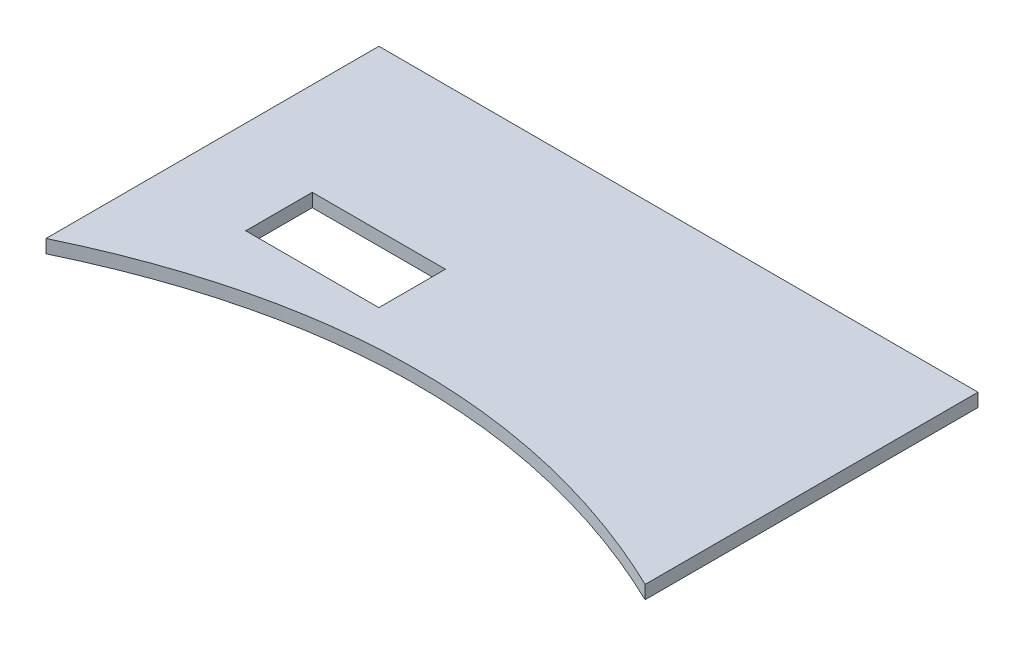
ISO-10303-21;
HEADER;
FILE_DESCRIPTION(('STEP AP214'),'2;1');
FILE_NAME('part.step','',(''),(''),'','','');
FILE_SCHEMA(('AUTOMOTIVE_DESIGN { 1 0 10303 214 1 1 1 1 }'));
ENDSEC;
DATA;
#1=APPLICATION_CONTEXT('core data for automotive mechanical design processes');
#2=APPLICATION_PROTOCOL_DEFINITION('international standard','automotive_design',2000,#1);
#3=PRODUCT_CONTEXT('',#1,'mechanical');
#4=PRODUCT('Part','Part','',(#3));
#5=PRODUCT_RELATED_PRODUCT_CATEGORY('part','',(#4));
#6=PRODUCT_DEFINITION_FORMATION('','',#4);
#7=PRODUCT_DEFINITION_CONTEXT('part definition',#1,'design');
#8=PRODUCT_DEFINITION('design','',#6,#7);
#9=PRODUCT_DEFINITION_SHAPE('','',#8);
#10=(LENGTH_UNIT() NAMED_UNIT(*) SI_UNIT(.MILLI.,.METRE.));
#11=(NAMED_UNIT(*) PLANE_ANGLE_UNIT() SI_UNIT($,.RADIAN.));
#12=(NAMED_UNIT(*) SI_UNIT($,.STERADIAN.) SOLID_ANGLE_UNIT());
#13=UNCERTAINTY_MEASURE_WITH_UNIT(LENGTH_MEASURE(1.E-05),#10,'distance_accuracy_value','');
#14=(GEOMETRIC_REPRESENTATION_CONTEXT(3) GLOBAL_UNCERTAINTY_ASSIGNED_CONTEXT((#13)) GLOBAL_UNIT_ASSIGNED_CONTEXT((#10,
#11,#12)) REPRESENTATION_CONTEXT('',''));
#15=CARTESIAN_POINT('',(0.,0.,0.));
#16=DIRECTION('',(0.,0.,1.));
#17=DIRECTION('',(1.,0.,0.));
#18=AXIS2_PLACEMENT_3D('',#15,#16,#17);
#19=CARTESIAN_POINT('',(-22.5,1.,12.5000003165409));
#20=CARTESIAN_POINT('',(-22.4397921681723,1.,12.4710624969978));
#21=CARTESIAN_POINT('',(-21.7203183892143,1.,12.1266713984864));
#22=CARTESIAN_POINT('',(-20.0332785478736,1.,11.3582096851381));
#23=CARTESIAN_POINT('',(-16.4871667514286,1.,9.92959339127587));
#24=CARTESIAN_POINT('',(-11.6492588308455,1.,8.4284125221381));
#25=CARTESIAN_POINT('',(-5.83109083774038,1.,7.34466532482607));
#26=CARTESIAN_POINT('',(-7.74170335046435E-08,1.,6.98122403326633));
#27=CARTESIAN_POINT('',(5.8310906931097,1.,7.34466516079498));
#28=CARTESIAN_POINT('',(11.6492587166721,1.,8.42841219441308));
#29=CARTESIAN_POINT('',(16.4871666794626,1.,9.92959292745506));
#30=CARTESIAN_POINT('',(20.033278516084,1.,11.3582091215817));
#31=CARTESIAN_POINT('',(21.7203183789281,1.,12.1266707874387));
#32=CARTESIAN_POINT('',(22.4397921674612,1.,12.4710618656634));
#33=CARTESIAN_POINT('',(22.4999999999906,1.,12.4999996834591));
#34=B_SPLINE_CURVE_WITH_KNOTS('',3,(#19,#20,#21,#22,#23,#24,#25,#26,#27,#28,#29,#30,#31,#32,
#33),.UNSPECIFIED.,.F.,.F.,(4,1,1,1,1,1,1,1,1,1,1,1,4),(0.0297124984412473,0.0335156519759702,
0.0751873987796753,0.135874913239724,0.25724994215982,0.378624971079917,0.500000000000013,
0.62137502892011,0.742750057840206,0.864125086760303,0.924812601220351,0.966484348023973,
0.970287501551606),.UNSPECIFIED.);
#35=DIRECTION('',(0.,-1.,0.));
#36=VECTOR('',#35,1.);
#37=SURFACE_OF_LINEAR_EXTRUSION('',#34,#36);
#38=CARTESIAN_POINT('',(-22.5,0.,12.5000003165409));
#39=CARTESIAN_POINT('',(-22.4397921681723,0.,12.4710624969978));
#40=CARTESIAN_POINT('',(-21.7203183892143,0.,12.1266713984864));
#41=CARTESIAN_POINT('',(-20.0332785478736,0.,11.3582096851381));
#42=CARTESIAN_POINT('',(-16.4871667514286,0.,9.92959339127587));
#43=CARTESIAN_POINT('',(-11.6492588308455,0.,8.4284125221381));
#44=CARTESIAN_POINT('',(-5.83109083774038,0.,7.34466532482607));
#45=CARTESIAN_POINT('',(-7.74170335046435E-08,0.,6.98122403326633));
#46=CARTESIAN_POINT('',(5.8310906931097,0.,7.34466516079498));
#47=CARTESIAN_POINT('',(11.6492587166721,0.,8.42841219441308));
#48=CARTESIAN_POINT('',(16.4871666794626,0.,9.92959292745506));
#49=CARTESIAN_POINT('',(20.033278516084,0.,11.3582091215817));
#50=CARTESIAN_POINT('',(21.7203183789281,0.,12.1266707874387));
#51=CARTESIAN_POINT('',(22.4397921674612,0.,12.4710618656634));
#52=CARTESIAN_POINT('',(22.4999999999906,0.,12.4999996834591));
#53=B_SPLINE_CURVE_WITH_KNOTS('',3,(#38,#39,#40,#41,#42,#43,#44,#45,#46,#47,#48,#49,#50,#51,
#52),.UNSPECIFIED.,.F.,.F.,(4,1,1,1,1,1,1,1,1,1,1,1,4),(0.0297124984412473,0.0335156519759702,
0.0751873987796753,0.135874913239724,0.25724994215982,0.378624971079917,0.500000000000013,
0.62137502892011,0.742750057840206,0.864125086760303,0.924812601220351,0.966484348023973,
0.970287501551606),.UNSPECIFIED.);
#54=CARTESIAN_POINT('',(-22.5,0.,12.5000003165409));
#55=VERTEX_POINT('',#54);
#56=CARTESIAN_POINT('',(22.4999999999965,0.,12.4999996834591));
#57=VERTEX_POINT('',#56);
#58=EDGE_CURVE('E131',#55,#57,#53,.T.);
#59=ORIENTED_EDGE('',*,*,#58,.T.);
#60=DIRECTION('',(0.,-1.,0.));
#61=VECTOR('',#60,1.);
#62=CARTESIAN_POINT('',(22.4999999999965,1.,12.4999996834591));
#63=LINE('',#62,#61);
#64=CARTESIAN_POINT('',(22.4999999999965,1.,12.4999996834591));
#65=VERTEX_POINT('',#64);
#66=EDGE_CURVE('E11',#65,#57,#63,.T.);
#67=ORIENTED_EDGE('',*,*,#66,.F.);
#68=CARTESIAN_POINT('',(-22.5,1.,12.5000003165409));
#69=VERTEX_POINT('',#68);
#70=EDGE_CURVE('E134',#69,#65,#34,.T.);
#71=ORIENTED_EDGE('',*,*,#70,.F.);
#72=DIRECTION('',(0.,-1.,0.));
#73=VECTOR('',#72,1.);
#74=CARTESIAN_POINT('',(-22.5,1.,12.5000003165409));
#75=LINE('',#74,#73);
#76=EDGE_CURVE('E150',#69,#55,#75,.T.);
#77=ORIENTED_EDGE('',*,*,#76,.T.);
#78=EDGE_LOOP('',(#59,#67,#71,#77));
#79=FACE_BOUND('',#78,.T.);
#80=ADVANCED_FACE('F33',(#79),#37,.F.);
#81=CARTESIAN_POINT('',(22.5,1.,-12.5000003165409));
#82=DIRECTION('',(-1.,0.,-1.38639100200066E-13));
#83=DIRECTION('',(-1.38639100200066E-13,0.,1.));
#84=AXIS2_PLACEMENT_3D('',#81,#82,#83);
#85=PLANE('',#84);
#86=DIRECTION('',(1.38639100200066E-13,0.,-1.));
#87=VECTOR('',#86,1.);
#88=CARTESIAN_POINT('',(22.5,0.,-12.5000003165409));
#89=LINE('',#88,#87);
#90=CARTESIAN_POINT('',(22.5,0.,-12.5000003165409));
#91=VERTEX_POINT('',#90);
#92=EDGE_CURVE('E155',#57,#91,#89,.T.);
#93=ORIENTED_EDGE('',*,*,#92,.T.);
#94=DIRECTION('',(0.,-1.,0.));
#95=VECTOR('',#94,1.);
#96=CARTESIAN_POINT('',(22.5,1.,-12.5000003165409));
#97=LINE('',#96,#95);
#98=CARTESIAN_POINT('',(22.5,1.,-12.5000003165409));
#99=VERTEX_POINT('',#98);
#100=EDGE_CURVE('E41',#99,#91,#97,.T.);
#101=ORIENTED_EDGE('',*,*,#100,.F.);
#102=DIRECTION('',(1.38639100200066E-13,0.,-1.));
#103=VECTOR('',#102,1.);
#104=CARTESIAN_POINT('',(22.5,1.,-12.5000003165409));
#105=LINE('',#104,#103);
#106=EDGE_CURVE('E140',#65,#99,#105,.T.);
#107=ORIENTED_EDGE('',*,*,#106,.F.);
#108=ORIENTED_EDGE('',*,*,#66,.T.);
#109=EDGE_LOOP('',(#93,#101,#107,#108));
#110=FACE_BOUND('',#109,.T.);
#111=ADVANCED_FACE('F186',(#110),#85,.F.);
#112=CARTESIAN_POINT('',(-22.5,1.,-12.5000003165409));
#113=DIRECTION('',(0.,0.,1.));
#114=DIRECTION('',(1.,0.,0.));
#115=AXIS2_PLACEMENT_3D('',#112,#113,#114);
#116=PLANE('',#115);
#117=DIRECTION('',(-1.,0.,0.));
#118=VECTOR('',#117,1.);
#119=CARTESIAN_POINT('',(-22.5,0.,-12.5000003165409));
#120=LINE('',#119,#118);
#121=CARTESIAN_POINT('',(-22.5,0.,-12.5000003165409));
#122=VERTEX_POINT('',#121);
#123=EDGE_CURVE('E160',#91,#122,#120,.T.);
#124=ORIENTED_EDGE('',*,*,#123,.T.);
#125=DIRECTION('',(0.,-1.,0.));
#126=VECTOR('',#125,1.);
#127=CARTESIAN_POINT('',(-22.5,1.,-12.5000003165409));
#128=LINE('',#127,#126);
#129=CARTESIAN_POINT('',(-22.5,1.,-12.5000003165409));
#130=VERTEX_POINT('',#129);
#131=EDGE_CURVE('E165',#130,#122,#128,.T.);
#132=ORIENTED_EDGE('',*,*,#131,.F.);
#133=DIRECTION('',(-1.,0.,0.));
#134=VECTOR('',#133,1.);
#135=CARTESIAN_POINT('',(-22.5,1.,-12.5000003165409));
#136=LINE('',#135,#134);
#137=EDGE_CURVE('E146',#99,#130,#136,.T.);
#138=ORIENTED_EDGE('',*,*,#137,.F.);
#139=ORIENTED_EDGE('',*,*,#100,.T.);
#140=EDGE_LOOP('',(#124,#132,#138,#139));
#141=FACE_BOUND('',#140,.T.);
#142=ADVANCED_FACE('F172',(#141),#116,.F.);
#143=CARTESIAN_POINT('',(-22.5,1.,12.5000003165409));
#144=DIRECTION('',(1.,0.,0.));
#145=DIRECTION('',(0.,0.,-1.));
#146=AXIS2_PLACEMENT_3D('',#143,#144,#145);
#147=PLANE('',#146);
#148=DIRECTION('',(0.,0.,1.));
#149=VECTOR('',#148,1.);
#150=CARTESIAN_POINT('',(-22.5,0.,12.5000003165409));
#151=LINE('',#150,#149);
#152=EDGE_CURVE('E141',#122,#55,#151,.T.);
#153=ORIENTED_EDGE('',*,*,#152,.T.);
#154=ORIENTED_EDGE('',*,*,#76,.F.);
#155=DIRECTION('',(0.,0.,1.));
#156=VECTOR('',#155,1.);
#157=CARTESIAN_POINT('',(-22.5,1.,12.5000003165409));
#158=LINE('',#157,#156);
#159=EDGE_CURVE('E148',#130,#69,#158,.T.);
#160=ORIENTED_EDGE('',*,*,#159,.F.);
#161=ORIENTED_EDGE('',*,*,#131,.T.);
#162=EDGE_LOOP('',(#153,#154,#160,#161));
#163=FACE_BOUND('',#162,.T.);
#164=ADVANCED_FACE('F179',(#163),#147,.F.);
#165=CARTESIAN_POINT('',(-7.58887755678566E-08,1.,7.1023711031144));
#166=DIRECTION('',(0.,1.,0.));
#167=DIRECTION('',(0.,0.,1.));
#168=AXIS2_PLACEMENT_3D('',#165,#166,#167);
#169=PLANE('',#168);
#170=DIRECTION('',(0.,0.,1.));
#171=VECTOR('',#170,1.);
#172=CARTESIAN_POINT('',(-15.5,1.,4.49999968345912));
#173=LINE('',#172,#171);
#174=CARTESIAN_POINT('',(-15.5,1.,-0.500000316540883));
#175=VERTEX_POINT('',#174);
#176=CARTESIAN_POINT('',(-15.5,1.,4.49999968345912));
#177=VERTEX_POINT('',#176);
#178=EDGE_CURVE('E48',#175,#177,#173,.T.);
#179=ORIENTED_EDGE('',*,*,#178,.F.);
#180=DIRECTION('',(-1.,0.,0.));
#181=VECTOR('',#180,1.);
#182=CARTESIAN_POINT('',(-15.5,1.,-0.500000316540883));
#183=LINE('',#182,#181);
#184=CARTESIAN_POINT('',(-5.5,1.,-0.500000316540883));
#185=VERTEX_POINT('',#184);
#186=EDGE_CURVE('E116',#185,#175,#183,.T.);
#187=ORIENTED_EDGE('',*,*,#186,.F.);
#188=DIRECTION('',(0.,0.,-1.));
#189=VECTOR('',#188,1.);
#190=CARTESIAN_POINT('',(-5.5,1.,4.49999968345912));
#191=LINE('',#190,#189);
#192=CARTESIAN_POINT('',(-5.5,1.,4.49999968345912));
#193=VERTEX_POINT('',#192);
#194=EDGE_CURVE('E119',#193,#185,#191,.T.);
#195=ORIENTED_EDGE('',*,*,#194,.F.);
#196=DIRECTION('',(1.,0.,0.));
#197=VECTOR('',#196,1.);
#198=CARTESIAN_POINT('',(-15.5,1.,4.49999968345912));
#199=LINE('',#198,#197);
#200=EDGE_CURVE('E125',#177,#193,#199,.T.);
#201=ORIENTED_EDGE('',*,*,#200,.F.);
#202=EDGE_LOOP('',(#179,#187,#195,#201));
#203=FACE_BOUND('',#202,.T.);
#204=ORIENTED_EDGE('',*,*,#70,.T.);
#205=ORIENTED_EDGE('',*,*,#106,.T.);
#206=ORIENTED_EDGE('',*,*,#137,.T.);
#207=ORIENTED_EDGE('',*,*,#159,.T.);
#208=EDGE_LOOP('',(#204,#205,#206,#207));
#209=FACE_BOUND('',#208,.T.);
#210=ADVANCED_FACE('F185',(#203,#209),#169,.T.);
#211=CARTESIAN_POINT('',(-7.58887755678566E-08,0.,7.1023711031144));
#212=DIRECTION('',(0.,1.,0.));
#213=DIRECTION('',(0.,0.,1.));
#214=AXIS2_PLACEMENT_3D('',#211,#212,#213);
#215=PLANE('',#214);
#216=DIRECTION('',(-1.,0.,0.));
#217=VECTOR('',#216,1.);
#218=CARTESIAN_POINT('',(-15.5,0.,-0.500000316540883));
#219=LINE('',#218,#217);
#220=CARTESIAN_POINT('',(-5.5,0.,-0.500000316540883));
#221=VERTEX_POINT('',#220);
#222=CARTESIAN_POINT('',(-15.5,0.,-0.500000316540883));
#223=VERTEX_POINT('',#222);
#224=EDGE_CURVE('E106',#221,#223,#219,.T.);
#225=ORIENTED_EDGE('',*,*,#224,.T.);
#226=DIRECTION('',(0.,0.,1.));
#227=VECTOR('',#226,1.);
#228=CARTESIAN_POINT('',(-15.5,0.,4.49999968345912));
#229=LINE('',#228,#227);
#230=CARTESIAN_POINT('',(-15.5,0.,4.49999968345912));
#231=VERTEX_POINT('',#230);
#232=EDGE_CURVE('E100',#223,#231,#229,.T.);
#233=ORIENTED_EDGE('',*,*,#232,.T.);
#234=DIRECTION('',(1.,0.,0.));
#235=VECTOR('',#234,1.);
#236=CARTESIAN_POINT('',(-15.5,0.,4.49999968345912));
#237=LINE('',#236,#235);
#238=CARTESIAN_POINT('',(-5.5,0.,4.49999968345912));
#239=VERTEX_POINT('',#238);
#240=EDGE_CURVE('E109',#231,#239,#237,.T.);
#241=ORIENTED_EDGE('',*,*,#240,.T.);
#242=DIRECTION('',(0.,0.,-1.));
#243=VECTOR('',#242,1.);
#244=CARTESIAN_POINT('',(-5.5,0.,4.49999968345912));
#245=LINE('',#244,#243);
#246=EDGE_CURVE('E56',#239,#221,#245,.T.);
#247=ORIENTED_EDGE('',*,*,#246,.T.);
#248=EDGE_LOOP('',(#225,#233,#241,#247));
#249=FACE_BOUND('',#248,.T.);
#250=ORIENTED_EDGE('',*,*,#58,.F.);
#251=ORIENTED_EDGE('',*,*,#152,.F.);
#252=ORIENTED_EDGE('',*,*,#123,.F.);
#253=ORIENTED_EDGE('',*,*,#92,.F.);
#254=EDGE_LOOP('',(#250,#251,#252,#253));
#255=FACE_BOUND('',#254,.T.);
#256=ADVANCED_FACE('F113',(#249,#255),#215,.F.);
#257=CARTESIAN_POINT('',(-15.5,0.,4.49999968345912));
#258=DIRECTION('',(-1.,0.,0.));
#259=DIRECTION('',(0.,0.,1.));
#260=AXIS2_PLACEMENT_3D('',#257,#258,#259);
#261=PLANE('',#260);
#262=ORIENTED_EDGE('',*,*,#178,.T.);
#263=DIRECTION('',(0.,1.,0.));
#264=VECTOR('',#263,1.);
#265=CARTESIAN_POINT('',(-15.5,0.,4.49999968345912));
#266=LINE('',#265,#264);
#267=EDGE_CURVE('E96',#231,#177,#266,.T.);
#268=ORIENTED_EDGE('',*,*,#267,.F.);
#269=ORIENTED_EDGE('',*,*,#232,.F.);
#270=DIRECTION('',(0.,1.,0.));
#271=VECTOR('',#270,1.);
#272=CARTESIAN_POINT('',(-15.5,0.,-0.500000316540883));
#273=LINE('',#272,#271);
#274=EDGE_CURVE('E129',#223,#175,#273,.T.);
#275=ORIENTED_EDGE('',*,*,#274,.T.);
#276=EDGE_LOOP('',(#262,#268,#269,#275));
#277=FACE_BOUND('',#276,.T.);
#278=ADVANCED_FACE('F98',(#277),#261,.F.);
#279=CARTESIAN_POINT('',(-15.5,0.,-0.500000316540883));
#280=DIRECTION('',(0.,0.,-1.));
#281=DIRECTION('',(-1.,0.,0.));
#282=AXIS2_PLACEMENT_3D('',#279,#280,#281);
#283=PLANE('',#282);
#284=ORIENTED_EDGE('',*,*,#186,.T.);
#285=ORIENTED_EDGE('',*,*,#274,.F.);
#286=ORIENTED_EDGE('',*,*,#224,.F.);
#287=DIRECTION('',(0.,1.,0.));
#288=VECTOR('',#287,1.);
#289=CARTESIAN_POINT('',(-5.5,0.,-0.500000316540883));
#290=LINE('',#289,#288);
#291=EDGE_CURVE('E132',#221,#185,#290,.T.);
#292=ORIENTED_EDGE('',*,*,#291,.T.);
#293=EDGE_LOOP('',(#284,#285,#286,#292));
#294=FACE_BOUND('',#293,.T.);
#295=ADVANCED_FACE('F203',(#294),#283,.F.);
#296=CARTESIAN_POINT('',(-5.5,0.,4.49999968345912));
#297=DIRECTION('',(1.,0.,0.));
#298=DIRECTION('',(0.,0.,-1.));
#299=AXIS2_PLACEMENT_3D('',#296,#297,#298);
#300=PLANE('',#299);
#301=ORIENTED_EDGE('',*,*,#194,.T.);
#302=ORIENTED_EDGE('',*,*,#291,.F.);
#303=ORIENTED_EDGE('',*,*,#246,.F.);
#304=DIRECTION('',(0.,1.,0.));
#305=VECTOR('',#304,1.);
#306=CARTESIAN_POINT('',(-5.5,0.,4.49999968345912));
#307=LINE('',#306,#305);
#308=EDGE_CURVE('E105',#239,#193,#307,.T.);
#309=ORIENTED_EDGE('',*,*,#308,.T.);
#310=EDGE_LOOP('',(#301,#302,#303,#309));
#311=FACE_BOUND('',#310,.T.);
#312=ADVANCED_FACE('F206',(#311),#300,.F.);
#313=CARTESIAN_POINT('',(-15.5,0.,4.49999968345912));
#314=DIRECTION('',(0.,0.,1.));
#315=DIRECTION('',(1.,0.,0.));
#316=AXIS2_PLACEMENT_3D('',#313,#314,#315);
#317=PLANE('',#316);
#318=ORIENTED_EDGE('',*,*,#200,.T.);
#319=ORIENTED_EDGE('',*,*,#308,.F.);
#320=ORIENTED_EDGE('',*,*,#240,.F.);
#321=ORIENTED_EDGE('',*,*,#267,.T.);
#322=EDGE_LOOP('',(#318,#319,#320,#321));
#323=FACE_BOUND('',#322,.T.);
#324=ADVANCED_FACE('F110',(#323),#317,.F.);
#325=CLOSED_SHELL('',(#80,#111,#142,#164,#210,#256,#278,#295,#312,#324));
#326=MANIFOLD_SOLID_BREP('B2',#325);
#327=ADVANCED_BREP_SHAPE_REPRESENTATION('',(#18,#326),#14);
#328=SHAPE_DEFINITION_REPRESENTATION(#9,#327);
ENDSEC;
END-ISO-10303-21;
